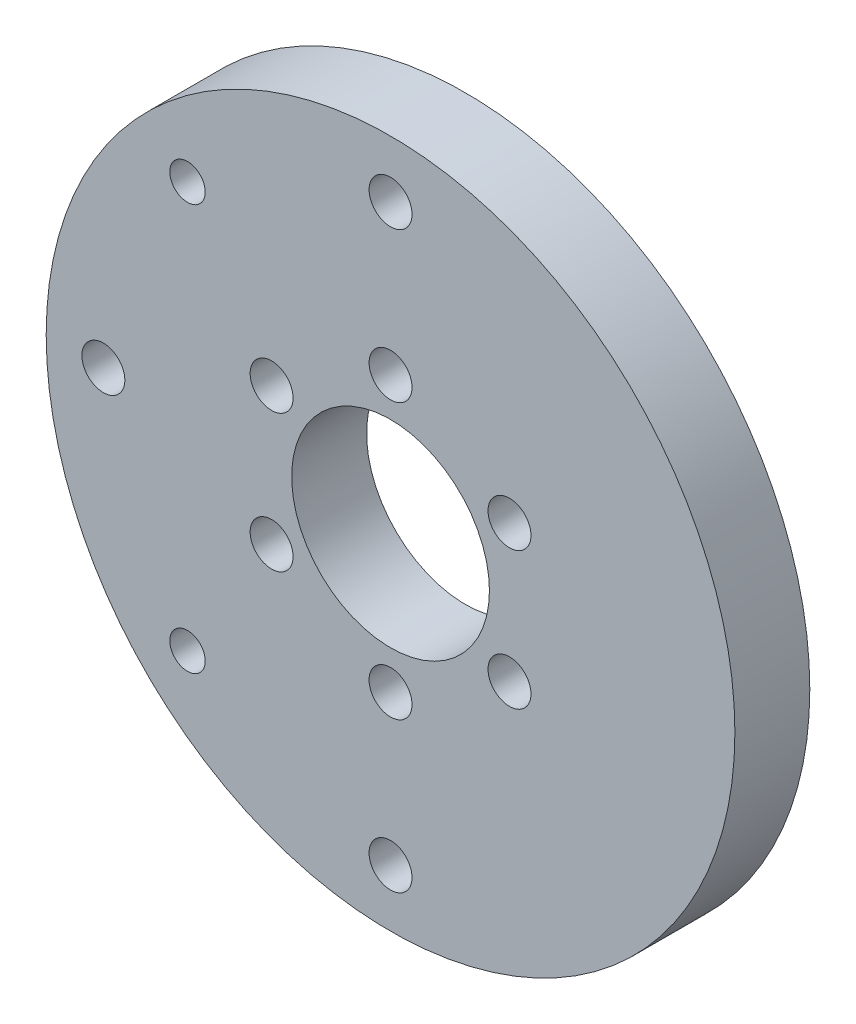
ISO-10303-21;
HEADER;
FILE_DESCRIPTION(('STEP AP214'),'2;1');
FILE_NAME('part.step','',(''),(''),'','','');
FILE_SCHEMA(('AUTOMOTIVE_DESIGN { 1 0 10303 214 1 1 1 1 }'));
ENDSEC;
DATA;
#1=APPLICATION_CONTEXT('core data for automotive mechanical design processes');
#2=APPLICATION_PROTOCOL_DEFINITION('international standard','automotive_design',2000,#1);
#3=PRODUCT_CONTEXT('',#1,'mechanical');
#4=PRODUCT('Part','Part','',(#3));
#5=PRODUCT_RELATED_PRODUCT_CATEGORY('part','',(#4));
#6=PRODUCT_DEFINITION_FORMATION('','',#4);
#7=PRODUCT_DEFINITION_CONTEXT('part definition',#1,'design');
#8=PRODUCT_DEFINITION('design','',#6,#7);
#9=PRODUCT_DEFINITION_SHAPE('','',#8);
#10=(LENGTH_UNIT() NAMED_UNIT(*) SI_UNIT(.MILLI.,.METRE.));
#11=(NAMED_UNIT(*) PLANE_ANGLE_UNIT() SI_UNIT($,.RADIAN.));
#12=(NAMED_UNIT(*) SI_UNIT($,.STERADIAN.) SOLID_ANGLE_UNIT());
#13=UNCERTAINTY_MEASURE_WITH_UNIT(LENGTH_MEASURE(1.E-05),#10,'distance_accuracy_value','');
#14=(GEOMETRIC_REPRESENTATION_CONTEXT(3) GLOBAL_UNCERTAINTY_ASSIGNED_CONTEXT((#13)) GLOBAL_UNIT_ASSIGNED_CONTEXT((#10,
#11,#12)) REPRESENTATION_CONTEXT('',''));
#15=CARTESIAN_POINT('',(0.,0.,0.));
#16=DIRECTION('',(0.,0.,1.));
#17=DIRECTION('',(1.,0.,0.));
#18=AXIS2_PLACEMENT_3D('',#15,#16,#17);
#19=CARTESIAN_POINT('',(0.,0.,6.));
#20=DIRECTION('',(0.,0.,1.));
#21=DIRECTION('',(1.,0.,0.));
#22=AXIS2_PLACEMENT_3D('',#19,#20,#21);
#23=PLANE('',#22);
#24=CARTESIAN_POINT('',(-9.52627944162888,-5.49999999999991,6.));
#25=DIRECTION('',(0.,0.,1.));
#26=DIRECTION('',(1.,0.,0.));
#27=AXIS2_PLACEMENT_3D('',#24,#25,#26);
#28=CIRCLE('',#27,1.72);
#29=CARTESIAN_POINT('',(-7.80627944162888,-5.49999999999991,6.));
#30=VERTEX_POINT('',#29);
#31=EDGE_CURVE('E107',#30,#30,#28,.T.);
#32=ORIENTED_EDGE('',*,*,#31,.F.);
#33=EDGE_LOOP('',(#32));
#34=FACE_BOUND('',#33,.T.);
#35=CARTESIAN_POINT('',(9.5262794416288,-5.50000000000004,6.));
#36=DIRECTION('',(0.,0.,1.));
#37=DIRECTION('',(1.,0.,0.));
#38=AXIS2_PLACEMENT_3D('',#35,#36,#37);
#39=CIRCLE('',#38,1.72);
#40=CARTESIAN_POINT('',(11.2462794416288,-5.50000000000004,6.));
#41=VERTEX_POINT('',#40);
#42=EDGE_CURVE('E111',#41,#41,#39,.T.);
#43=ORIENTED_EDGE('',*,*,#42,.F.);
#44=EDGE_LOOP('',(#43));
#45=FACE_BOUND('',#44,.T.);
#46=CARTESIAN_POINT('',(-16.2634559672904,16.2634559672908,6.));
#47=DIRECTION('',(0.,0.,1.));
#48=DIRECTION('',(1.,0.,0.));
#49=AXIS2_PLACEMENT_3D('',#46,#47,#48);
#50=CIRCLE('',#49,1.42);
#51=CARTESIAN_POINT('',(-14.8434559672904,16.2634559672908,6.));
#52=VERTEX_POINT('',#51);
#53=EDGE_CURVE('E60',#52,#52,#50,.T.);
#54=ORIENTED_EDGE('',*,*,#53,.F.);
#55=EDGE_LOOP('',(#54));
#56=FACE_BOUND('',#55,.T.);
#57=CARTESIAN_POINT('',(-16.2634559672907,-16.2634559672906,6.));
#58=DIRECTION('',(0.,0.,1.));
#59=DIRECTION('',(1.,0.,0.));
#60=AXIS2_PLACEMENT_3D('',#57,#58,#59);
#61=CIRCLE('',#60,1.42);
#62=CARTESIAN_POINT('',(-14.8434559672907,-16.2634559672906,6.));
#63=VERTEX_POINT('',#62);
#64=EDGE_CURVE('E72',#63,#63,#61,.T.);
#65=ORIENTED_EDGE('',*,*,#64,.F.);
#66=EDGE_LOOP('',(#65));
#67=FACE_BOUND('',#66,.T.);
#68=CARTESIAN_POINT('',(0.,11.,6.));
#69=DIRECTION('',(0.,0.,1.));
#70=DIRECTION('',(1.,0.,0.));
#71=AXIS2_PLACEMENT_3D('',#68,#69,#70);
#72=CIRCLE('',#71,1.72);
#73=CARTESIAN_POINT('',(1.72,11.,6.));
#74=VERTEX_POINT('',#73);
#75=EDGE_CURVE('E59',#74,#74,#72,.T.);
#76=ORIENTED_EDGE('',*,*,#75,.F.);
#77=EDGE_LOOP('',(#76));
#78=FACE_BOUND('',#77,.T.);
#79=CARTESIAN_POINT('',(0.,0.,6.));
#80=DIRECTION('',(0.,0.,1.));
#81=DIRECTION('',(1.,0.,0.));
#82=AXIS2_PLACEMENT_3D('',#79,#80,#81);
#83=CIRCLE('',#82,7.92);
#84=CARTESIAN_POINT('',(7.92,0.,6.));
#85=VERTEX_POINT('',#84);
#86=EDGE_CURVE('E47',#85,#85,#83,.T.);
#87=ORIENTED_EDGE('',*,*,#86,.F.);
#88=EDGE_LOOP('',(#87));
#89=FACE_BOUND('',#88,.T.);
#90=CARTESIAN_POINT('',(0.,0.,6.));
#91=DIRECTION('',(0.,0.,1.));
#92=DIRECTION('',(1.,0.,0.));
#93=AXIS2_PLACEMENT_3D('',#90,#91,#92);
#94=CIRCLE('',#93,27.58);
#95=CARTESIAN_POINT('',(27.58,0.,6.));
#96=VERTEX_POINT('',#95);
#97=EDGE_CURVE('E11',#96,#96,#94,.T.);
#98=ORIENTED_EDGE('',*,*,#97,.T.);
#99=EDGE_LOOP('',(#98));
#100=FACE_BOUND('',#99,.T.);
#101=CARTESIAN_POINT('',(0.,23.,6.));
#102=DIRECTION('',(0.,0.,1.));
#103=DIRECTION('',(1.,0.,0.));
#104=AXIS2_PLACEMENT_3D('',#101,#102,#103);
#105=CIRCLE('',#104,1.72);
#106=CARTESIAN_POINT('',(1.72,23.,6.));
#107=VERTEX_POINT('',#106);
#108=EDGE_CURVE('E53',#107,#107,#105,.T.);
#109=ORIENTED_EDGE('',*,*,#108,.F.);
#110=EDGE_LOOP('',(#109));
#111=FACE_BOUND('',#110,.T.);
#112=CARTESIAN_POINT('',(0.,-23.0000000000001,6.));
#113=DIRECTION('',(0.,0.,1.));
#114=DIRECTION('',(1.,0.,0.));
#115=AXIS2_PLACEMENT_3D('',#112,#113,#114);
#116=CIRCLE('',#115,1.72);
#117=CARTESIAN_POINT('',(1.71999999999992,-23.0000000000001,6.));
#118=VERTEX_POINT('',#117);
#119=EDGE_CURVE('E128',#118,#118,#116,.T.);
#120=ORIENTED_EDGE('',*,*,#119,.F.);
#121=EDGE_LOOP('',(#120));
#122=FACE_BOUND('',#121,.T.);
#123=CARTESIAN_POINT('',(-22.9999999999998,-3.99312779131623E-13,6.));
#124=DIRECTION('',(0.,0.,1.));
#125=DIRECTION('',(1.,0.,0.));
#126=AXIS2_PLACEMENT_3D('',#123,#124,#125);
#127=CIRCLE('',#126,1.72);
#128=CARTESIAN_POINT('',(-21.2799999999998,-3.99312779131623E-13,6.));
#129=VERTEX_POINT('',#128);
#130=EDGE_CURVE('E66',#129,#129,#127,.T.);
#131=ORIENTED_EDGE('',*,*,#130,.F.);
#132=EDGE_LOOP('',(#131));
#133=FACE_BOUND('',#132,.T.);
#134=CARTESIAN_POINT('',(9.52627944162884,5.49999999999998,6.));
#135=DIRECTION('',(0.,0.,1.));
#136=DIRECTION('',(1.,0.,0.));
#137=AXIS2_PLACEMENT_3D('',#134,#135,#136);
#138=CIRCLE('',#137,1.72);
#139=CARTESIAN_POINT('',(11.2462794416288,5.49999999999998,6.));
#140=VERTEX_POINT('',#139);
#141=EDGE_CURVE('E65',#140,#140,#138,.T.);
#142=ORIENTED_EDGE('',*,*,#141,.F.);
#143=EDGE_LOOP('',(#142));
#144=FACE_BOUND('',#143,.T.);
#145=CARTESIAN_POINT('',(0.,-11.,6.));
#146=DIRECTION('',(0.,0.,1.));
#147=DIRECTION('',(1.,0.,0.));
#148=AXIS2_PLACEMENT_3D('',#145,#146,#147);
#149=CIRCLE('',#148,1.72);
#150=CARTESIAN_POINT('',(1.71999999999992,-11.,6.));
#151=VERTEX_POINT('',#150);
#152=EDGE_CURVE('E136',#151,#151,#149,.T.);
#153=ORIENTED_EDGE('',*,*,#152,.F.);
#154=EDGE_LOOP('',(#153));
#155=FACE_BOUND('',#154,.T.);
#156=CARTESIAN_POINT('',(-9.52627944162876,5.50000000000011,6.));
#157=DIRECTION('',(0.,0.,1.));
#158=DIRECTION('',(1.,0.,0.));
#159=AXIS2_PLACEMENT_3D('',#156,#157,#158);
#160=CIRCLE('',#159,1.72);
#161=CARTESIAN_POINT('',(-7.80627944162876,5.50000000000011,6.));
#162=VERTEX_POINT('',#161);
#163=EDGE_CURVE('E139',#162,#162,#160,.T.);
#164=ORIENTED_EDGE('',*,*,#163,.F.);
#165=EDGE_LOOP('',(#164));
#166=FACE_BOUND('',#165,.T.);
#167=ADVANCED_FACE('F34',(#34,#45,#56,#67,#78,#89,#100,#111,#122,#133,#144,#155,#166),#23,.T.);
#168=CARTESIAN_POINT('',(0.,0.,0.));
#169=DIRECTION('',(0.,0.,1.));
#170=DIRECTION('',(1.,0.,0.));
#171=AXIS2_PLACEMENT_3D('',#168,#169,#170);
#172=PLANE('',#171);
#173=CARTESIAN_POINT('',(-9.52627944162888,-5.49999999999991,0.));
#174=DIRECTION('',(0.,0.,1.));
#175=DIRECTION('',(1.,0.,0.));
#176=AXIS2_PLACEMENT_3D('',#173,#174,#175);
#177=CIRCLE('',#176,1.72);
#178=CARTESIAN_POINT('',(-7.80627944162888,-5.49999999999991,0.));
#179=VERTEX_POINT('',#178);
#180=EDGE_CURVE('E141',#179,#179,#177,.T.);
#181=ORIENTED_EDGE('',*,*,#180,.T.);
#182=EDGE_LOOP('',(#181));
#183=FACE_BOUND('',#182,.T.);
#184=CARTESIAN_POINT('',(9.5262794416288,-5.50000000000004,0.));
#185=DIRECTION('',(0.,0.,1.));
#186=DIRECTION('',(1.,0.,0.));
#187=AXIS2_PLACEMENT_3D('',#184,#185,#186);
#188=CIRCLE('',#187,1.72);
#189=CARTESIAN_POINT('',(11.2462794416288,-5.50000000000004,0.));
#190=VERTEX_POINT('',#189);
#191=EDGE_CURVE('E153',#190,#190,#188,.T.);
#192=ORIENTED_EDGE('',*,*,#191,.T.);
#193=EDGE_LOOP('',(#192));
#194=FACE_BOUND('',#193,.T.);
#195=CARTESIAN_POINT('',(-16.2634559672904,16.2634559672908,0.));
#196=DIRECTION('',(0.,0.,1.));
#197=DIRECTION('',(1.,0.,0.));
#198=AXIS2_PLACEMENT_3D('',#195,#196,#197);
#199=CIRCLE('',#198,1.42);
#200=CARTESIAN_POINT('',(-14.8434559672904,16.2634559672908,0.));
#201=VERTEX_POINT('',#200);
#202=EDGE_CURVE('E63',#201,#201,#199,.T.);
#203=ORIENTED_EDGE('',*,*,#202,.T.);
#204=EDGE_LOOP('',(#203));
#205=FACE_BOUND('',#204,.T.);
#206=CARTESIAN_POINT('',(-16.2634559672907,-16.2634559672906,0.));
#207=DIRECTION('',(0.,0.,1.));
#208=DIRECTION('',(1.,0.,0.));
#209=AXIS2_PLACEMENT_3D('',#206,#207,#208);
#210=CIRCLE('',#209,1.42);
#211=CARTESIAN_POINT('',(-14.8434559672907,-16.2634559672906,0.));
#212=VERTEX_POINT('',#211);
#213=EDGE_CURVE('E68',#212,#212,#210,.T.);
#214=ORIENTED_EDGE('',*,*,#213,.T.);
#215=EDGE_LOOP('',(#214));
#216=FACE_BOUND('',#215,.T.);
#217=CARTESIAN_POINT('',(0.,11.,0.));
#218=DIRECTION('',(0.,0.,1.));
#219=DIRECTION('',(1.,0.,0.));
#220=AXIS2_PLACEMENT_3D('',#217,#218,#219);
#221=CIRCLE('',#220,1.72);
#222=CARTESIAN_POINT('',(1.72,11.,0.));
#223=VERTEX_POINT('',#222);
#224=EDGE_CURVE('E164',#223,#223,#221,.T.);
#225=ORIENTED_EDGE('',*,*,#224,.T.);
#226=EDGE_LOOP('',(#225));
#227=FACE_BOUND('',#226,.T.);
#228=CARTESIAN_POINT('',(0.,0.,0.));
#229=DIRECTION('',(0.,0.,1.));
#230=DIRECTION('',(1.,0.,0.));
#231=AXIS2_PLACEMENT_3D('',#228,#229,#230);
#232=CIRCLE('',#231,7.92);
#233=CARTESIAN_POINT('',(7.92,0.,0.));
#234=VERTEX_POINT('',#233);
#235=EDGE_CURVE('E50',#234,#234,#232,.T.);
#236=ORIENTED_EDGE('',*,*,#235,.T.);
#237=EDGE_LOOP('',(#236));
#238=FACE_BOUND('',#237,.T.);
#239=CARTESIAN_POINT('',(0.,0.,0.));
#240=DIRECTION('',(0.,0.,1.));
#241=DIRECTION('',(1.,0.,0.));
#242=AXIS2_PLACEMENT_3D('',#239,#240,#241);
#243=CIRCLE('',#242,27.58);
#244=CARTESIAN_POINT('',(27.58,0.,0.));
#245=VERTEX_POINT('',#244);
#246=EDGE_CURVE('E42',#245,#245,#243,.T.);
#247=ORIENTED_EDGE('',*,*,#246,.F.);
#248=EDGE_LOOP('',(#247));
#249=FACE_BOUND('',#248,.T.);
#250=CARTESIAN_POINT('',(0.,23.,0.));
#251=DIRECTION('',(0.,0.,1.));
#252=DIRECTION('',(1.,0.,0.));
#253=AXIS2_PLACEMENT_3D('',#250,#251,#252);
#254=CIRCLE('',#253,1.72);
#255=CARTESIAN_POINT('',(1.72,23.,0.));
#256=VERTEX_POINT('',#255);
#257=EDGE_CURVE('E56',#256,#256,#254,.T.);
#258=ORIENTED_EDGE('',*,*,#257,.T.);
#259=EDGE_LOOP('',(#258));
#260=FACE_BOUND('',#259,.T.);
#261=CARTESIAN_POINT('',(0.,-23.0000000000001,0.));
#262=DIRECTION('',(0.,0.,1.));
#263=DIRECTION('',(1.,0.,0.));
#264=AXIS2_PLACEMENT_3D('',#261,#262,#263);
#265=CIRCLE('',#264,1.72);
#266=CARTESIAN_POINT('',(1.71999999999992,-23.0000000000001,0.));
#267=VERTEX_POINT('',#266);
#268=EDGE_CURVE('E165',#267,#267,#265,.T.);
#269=ORIENTED_EDGE('',*,*,#268,.T.);
#270=EDGE_LOOP('',(#269));
#271=FACE_BOUND('',#270,.T.);
#272=CARTESIAN_POINT('',(-22.9999999999998,-3.99312779131623E-13,0.));
#273=DIRECTION('',(0.,0.,1.));
#274=DIRECTION('',(1.,0.,0.));
#275=AXIS2_PLACEMENT_3D('',#272,#273,#274);
#276=CIRCLE('',#275,1.72);
#277=CARTESIAN_POINT('',(-21.2799999999998,-3.99312779131623E-13,0.));
#278=VERTEX_POINT('',#277);
#279=EDGE_CURVE('E38',#278,#278,#276,.T.);
#280=ORIENTED_EDGE('',*,*,#279,.T.);
#281=EDGE_LOOP('',(#280));
#282=FACE_BOUND('',#281,.T.);
#283=CARTESIAN_POINT('',(9.52627944162884,5.49999999999998,0.));
#284=DIRECTION('',(0.,0.,1.));
#285=DIRECTION('',(1.,0.,0.));
#286=AXIS2_PLACEMENT_3D('',#283,#284,#285);
#287=CIRCLE('',#286,1.72);
#288=CARTESIAN_POINT('',(11.2462794416288,5.49999999999998,0.));
#289=VERTEX_POINT('',#288);
#290=EDGE_CURVE('E157',#289,#289,#287,.T.);
#291=ORIENTED_EDGE('',*,*,#290,.T.);
#292=EDGE_LOOP('',(#291));
#293=FACE_BOUND('',#292,.T.);
#294=CARTESIAN_POINT('',(0.,-11.,0.));
#295=DIRECTION('',(0.,0.,1.));
#296=DIRECTION('',(1.,0.,0.));
#297=AXIS2_PLACEMENT_3D('',#294,#295,#296);
#298=CIRCLE('',#297,1.72);
#299=CARTESIAN_POINT('',(1.71999999999992,-11.,0.));
#300=VERTEX_POINT('',#299);
#301=EDGE_CURVE('E150',#300,#300,#298,.T.);
#302=ORIENTED_EDGE('',*,*,#301,.T.);
#303=EDGE_LOOP('',(#302));
#304=FACE_BOUND('',#303,.T.);
#305=CARTESIAN_POINT('',(-9.52627944162876,5.50000000000011,0.));
#306=DIRECTION('',(0.,0.,1.));
#307=DIRECTION('',(1.,0.,0.));
#308=AXIS2_PLACEMENT_3D('',#305,#306,#307);
#309=CIRCLE('',#308,1.72);
#310=CARTESIAN_POINT('',(-7.80627944162876,5.50000000000011,0.));
#311=VERTEX_POINT('',#310);
#312=EDGE_CURVE('E142',#311,#311,#309,.T.);
#313=ORIENTED_EDGE('',*,*,#312,.T.);
#314=EDGE_LOOP('',(#313));
#315=FACE_BOUND('',#314,.T.);
#316=ADVANCED_FACE('F77',(#183,#194,#205,#216,#227,#238,#249,#260,#271,#282,#293,#304,#315),
#172,.F.);
#317=CARTESIAN_POINT('',(0.,0.,6.));
#318=DIRECTION('',(0.,0.,-1.));
#319=DIRECTION('',(-1.,0.,0.));
#320=AXIS2_PLACEMENT_3D('',#317,#318,#319);
#321=CYLINDRICAL_SURFACE('',#320,27.58);
#322=ORIENTED_EDGE('',*,*,#97,.F.);
#323=EDGE_LOOP('',(#322));
#324=FACE_BOUND('',#323,.T.);
#325=ORIENTED_EDGE('',*,*,#246,.T.);
#326=EDGE_LOOP('',(#325));
#327=FACE_BOUND('',#326,.T.);
#328=ADVANCED_FACE('F101',(#324,#327),#321,.T.);
#329=CARTESIAN_POINT('',(0.,0.,6.));
#330=DIRECTION('',(0.,0.,-1.));
#331=DIRECTION('',(-1.,0.,0.));
#332=AXIS2_PLACEMENT_3D('',#329,#330,#331);
#333=CYLINDRICAL_SURFACE('',#332,7.92);
#334=ORIENTED_EDGE('',*,*,#86,.T.);
#335=EDGE_LOOP('',(#334));
#336=FACE_BOUND('',#335,.T.);
#337=ORIENTED_EDGE('',*,*,#235,.F.);
#338=EDGE_LOOP('',(#337));
#339=FACE_BOUND('',#338,.T.);
#340=ADVANCED_FACE('F176',(#336,#339),#333,.F.);
#341=CARTESIAN_POINT('',(0.,23.,6.));
#342=DIRECTION('',(0.,0.,-1.));
#343=DIRECTION('',(-1.,0.,0.));
#344=AXIS2_PLACEMENT_3D('',#341,#342,#343);
#345=CYLINDRICAL_SURFACE('',#344,1.72);
#346=ORIENTED_EDGE('',*,*,#108,.T.);
#347=EDGE_LOOP('',(#346));
#348=FACE_BOUND('',#347,.T.);
#349=ORIENTED_EDGE('',*,*,#257,.F.);
#350=EDGE_LOOP('',(#349));
#351=FACE_BOUND('',#350,.T.);
#352=ADVANCED_FACE('F178',(#348,#351),#345,.F.);
#353=CARTESIAN_POINT('',(0.,11.,6.));
#354=DIRECTION('',(0.,0.,-1.));
#355=DIRECTION('',(-1.,0.,0.));
#356=AXIS2_PLACEMENT_3D('',#353,#354,#355);
#357=CYLINDRICAL_SURFACE('',#356,1.72);
#358=ORIENTED_EDGE('',*,*,#75,.T.);
#359=EDGE_LOOP('',(#358));
#360=FACE_BOUND('',#359,.T.);
#361=ORIENTED_EDGE('',*,*,#224,.F.);
#362=EDGE_LOOP('',(#361));
#363=FACE_BOUND('',#362,.T.);
#364=ADVANCED_FACE('F184',(#360,#363),#357,.F.);
#365=CARTESIAN_POINT('',(0.,-23.0000000000001,6.));
#366=DIRECTION('',(0.,0.,-1.));
#367=DIRECTION('',(-1.,0.,0.));
#368=AXIS2_PLACEMENT_3D('',#365,#366,#367);
#369=CYLINDRICAL_SURFACE('',#368,1.72);
#370=ORIENTED_EDGE('',*,*,#119,.T.);
#371=EDGE_LOOP('',(#370));
#372=FACE_BOUND('',#371,.T.);
#373=ORIENTED_EDGE('',*,*,#268,.F.);
#374=EDGE_LOOP('',(#373));
#375=FACE_BOUND('',#374,.T.);
#376=ADVANCED_FACE('F92',(#372,#375),#369,.F.);
#377=CARTESIAN_POINT('',(-16.2634559672907,-16.2634559672906,6.));
#378=DIRECTION('',(0.,0.,-1.));
#379=DIRECTION('',(-1.,0.,0.));
#380=AXIS2_PLACEMENT_3D('',#377,#378,#379);
#381=CYLINDRICAL_SURFACE('',#380,1.42);
#382=ORIENTED_EDGE('',*,*,#64,.T.);
#383=EDGE_LOOP('',(#382));
#384=FACE_BOUND('',#383,.T.);
#385=ORIENTED_EDGE('',*,*,#213,.F.);
#386=EDGE_LOOP('',(#385));
#387=FACE_BOUND('',#386,.T.);
#388=ADVANCED_FACE('F83',(#384,#387),#381,.F.);
#389=CARTESIAN_POINT('',(-22.9999999999998,-3.99312779131623E-13,6.));
#390=DIRECTION('',(0.,0.,-1.));
#391=DIRECTION('',(-1.,0.,0.));
#392=AXIS2_PLACEMENT_3D('',#389,#390,#391);
#393=CYLINDRICAL_SURFACE('',#392,1.72);
#394=ORIENTED_EDGE('',*,*,#130,.T.);
#395=EDGE_LOOP('',(#394));
#396=FACE_BOUND('',#395,.T.);
#397=ORIENTED_EDGE('',*,*,#279,.F.);
#398=EDGE_LOOP('',(#397));
#399=FACE_BOUND('',#398,.T.);
#400=ADVANCED_FACE('F80',(#396,#399),#393,.F.);
#401=CARTESIAN_POINT('',(-16.2634559672904,16.2634559672908,6.));
#402=DIRECTION('',(0.,0.,-1.));
#403=DIRECTION('',(-1.,0.,0.));
#404=AXIS2_PLACEMENT_3D('',#401,#402,#403);
#405=CYLINDRICAL_SURFACE('',#404,1.42);
#406=ORIENTED_EDGE('',*,*,#53,.T.);
#407=EDGE_LOOP('',(#406));
#408=FACE_BOUND('',#407,.T.);
#409=ORIENTED_EDGE('',*,*,#202,.F.);
#410=EDGE_LOOP('',(#409));
#411=FACE_BOUND('',#410,.T.);
#412=ADVANCED_FACE('F82',(#408,#411),#405,.F.);
#413=CARTESIAN_POINT('',(9.52627944162884,5.49999999999998,6.));
#414=DIRECTION('',(0.,0.,-1.));
#415=DIRECTION('',(-1.,0.,0.));
#416=AXIS2_PLACEMENT_3D('',#413,#414,#415);
#417=CYLINDRICAL_SURFACE('',#416,1.72);
#418=ORIENTED_EDGE('',*,*,#141,.T.);
#419=EDGE_LOOP('',(#418));
#420=FACE_BOUND('',#419,.T.);
#421=ORIENTED_EDGE('',*,*,#290,.F.);
#422=EDGE_LOOP('',(#421));
#423=FACE_BOUND('',#422,.T.);
#424=ADVANCED_FACE('F89',(#420,#423),#417,.F.);
#425=CARTESIAN_POINT('',(9.5262794416288,-5.50000000000004,6.));
#426=DIRECTION('',(0.,0.,-1.));
#427=DIRECTION('',(-1.,0.,0.));
#428=AXIS2_PLACEMENT_3D('',#425,#426,#427);
#429=CYLINDRICAL_SURFACE('',#428,1.72);
#430=ORIENTED_EDGE('',*,*,#42,.T.);
#431=EDGE_LOOP('',(#430));
#432=FACE_BOUND('',#431,.T.);
#433=ORIENTED_EDGE('',*,*,#191,.F.);
#434=EDGE_LOOP('',(#433));
#435=FACE_BOUND('',#434,.T.);
#436=ADVANCED_FACE('F198',(#432,#435),#429,.F.);
#437=CARTESIAN_POINT('',(0.,-11.,6.));
#438=DIRECTION('',(0.,0.,-1.));
#439=DIRECTION('',(-1.,0.,0.));
#440=AXIS2_PLACEMENT_3D('',#437,#438,#439);
#441=CYLINDRICAL_SURFACE('',#440,1.72);
#442=ORIENTED_EDGE('',*,*,#152,.T.);
#443=EDGE_LOOP('',(#442));
#444=FACE_BOUND('',#443,.T.);
#445=ORIENTED_EDGE('',*,*,#301,.F.);
#446=EDGE_LOOP('',(#445));
#447=FACE_BOUND('',#446,.T.);
#448=ADVANCED_FACE('F202',(#444,#447),#441,.F.);
#449=CARTESIAN_POINT('',(-9.52627944162888,-5.49999999999991,6.));
#450=DIRECTION('',(0.,0.,-1.));
#451=DIRECTION('',(-1.,0.,0.));
#452=AXIS2_PLACEMENT_3D('',#449,#450,#451);
#453=CYLINDRICAL_SURFACE('',#452,1.72);
#454=ORIENTED_EDGE('',*,*,#31,.T.);
#455=EDGE_LOOP('',(#454));
#456=FACE_BOUND('',#455,.T.);
#457=ORIENTED_EDGE('',*,*,#180,.F.);
#458=EDGE_LOOP('',(#457));
#459=FACE_BOUND('',#458,.T.);
#460=ADVANCED_FACE('F205',(#456,#459),#453,.F.);
#461=CARTESIAN_POINT('',(-9.52627944162876,5.50000000000011,6.));
#462=DIRECTION('',(0.,0.,-1.));
#463=DIRECTION('',(-1.,0.,0.));
#464=AXIS2_PLACEMENT_3D('',#461,#462,#463);
#465=CYLINDRICAL_SURFACE('',#464,1.72);
#466=ORIENTED_EDGE('',*,*,#163,.T.);
#467=EDGE_LOOP('',(#466));
#468=FACE_BOUND('',#467,.T.);
#469=ORIENTED_EDGE('',*,*,#312,.F.);
#470=EDGE_LOOP('',(#469));
#471=FACE_BOUND('',#470,.T.);
#472=ADVANCED_FACE('F36',(#468,#471),#465,.F.);
#473=CLOSED_SHELL('',(#167,#316,#328,#340,#352,#364,#376,#388,#400,#412,#424,#436,#448,#460,#472));
#474=MANIFOLD_SOLID_BREP('B2',#473);
#475=ADVANCED_BREP_SHAPE_REPRESENTATION('',(#18,#474),#14);
#476=SHAPE_DEFINITION_REPRESENTATION(#9,#475);
ENDSEC;
END-ISO-10303-21;
